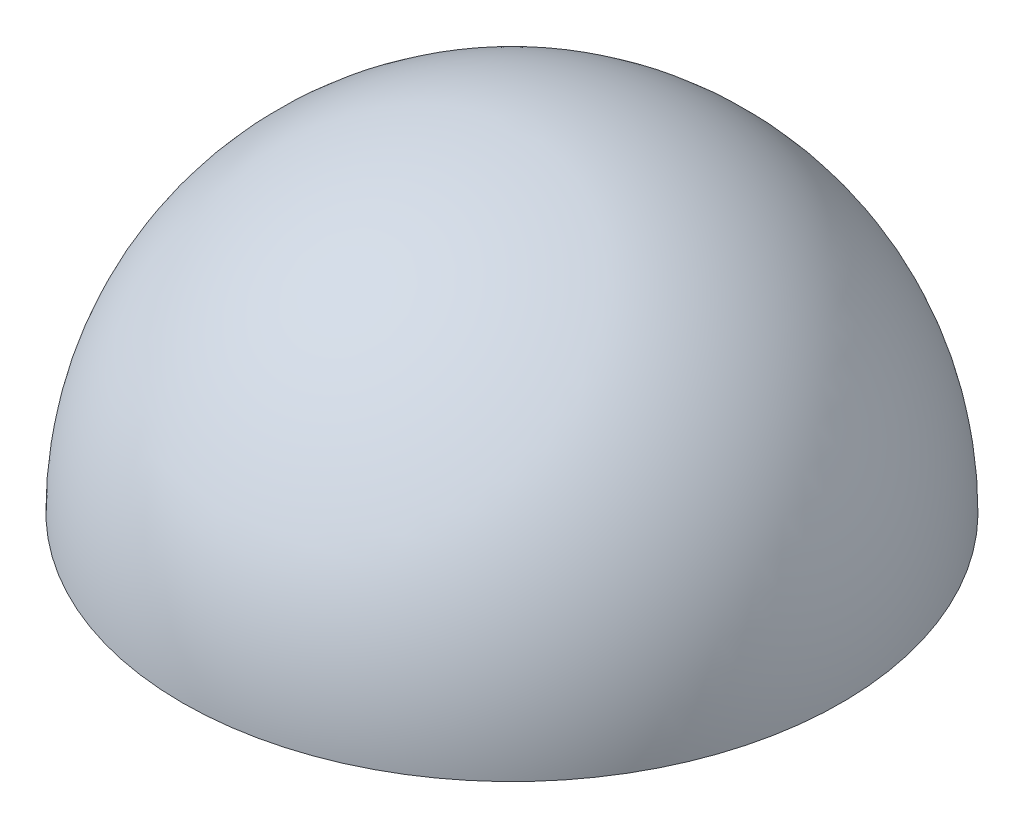
ISO-10303-21;
HEADER;
FILE_DESCRIPTION(('STEP AP214'),'2;1');
FILE_NAME('part.step','',(''),(''),'','','');
FILE_SCHEMA(('AUTOMOTIVE_DESIGN { 1 0 10303 214 1 1 1 1 }'));
ENDSEC;
DATA;
#1=APPLICATION_CONTEXT('core data for automotive mechanical design processes');
#2=APPLICATION_PROTOCOL_DEFINITION('international standard','automotive_design',2000,#1);
#3=PRODUCT_CONTEXT('',#1,'mechanical');
#4=PRODUCT('Part','Part','',(#3));
#5=PRODUCT_RELATED_PRODUCT_CATEGORY('part','',(#4));
#6=PRODUCT_DEFINITION_FORMATION('','',#4);
#7=PRODUCT_DEFINITION_CONTEXT('part definition',#1,'design');
#8=PRODUCT_DEFINITION('design','',#6,#7);
#9=PRODUCT_DEFINITION_SHAPE('','',#8);
#10=(LENGTH_UNIT() NAMED_UNIT(*) SI_UNIT(.MILLI.,.METRE.));
#11=(NAMED_UNIT(*) PLANE_ANGLE_UNIT() SI_UNIT($,.RADIAN.));
#12=(NAMED_UNIT(*) SI_UNIT($,.STERADIAN.) SOLID_ANGLE_UNIT());
#13=UNCERTAINTY_MEASURE_WITH_UNIT(LENGTH_MEASURE(1.E-05),#10,'distance_accuracy_value','');
#14=(GEOMETRIC_REPRESENTATION_CONTEXT(3) GLOBAL_UNCERTAINTY_ASSIGNED_CONTEXT((#13)) GLOBAL_UNIT_ASSIGNED_CONTEXT((#10,
#11,#12)) REPRESENTATION_CONTEXT('',''));
#15=CARTESIAN_POINT('',(0.,0.,0.));
#16=DIRECTION('',(0.,0.,1.));
#17=DIRECTION('',(1.,0.,0.));
#18=AXIS2_PLACEMENT_3D('',#15,#16,#17);
#19=CARTESIAN_POINT('',(10.,0.,0.));
#20=DIRECTION('',(-1.,0.,0.));
#21=DIRECTION('',(0.,0.,1.));
#22=AXIS2_PLACEMENT_3D('',#19,#20,#21);
#23=SPHERICAL_SURFACE('',#22,10.);
#24=CARTESIAN_POINT('',(10.,0.,0.));
#25=DIRECTION('',(0.,-1.,0.));
#26=DIRECTION('',(0.,0.,1.));
#27=AXIS2_PLACEMENT_3D('',#24,#25,#26);
#28=SPHERICAL_SURFACE('',#27,10.);
#29=CARTESIAN_POINT('',(10.,0.,0.));
#30=DIRECTION('',(0.,-1.,0.));
#31=DIRECTION('',(0.,0.,1.));
#32=AXIS2_PLACEMENT_3D('',#29,#30,#31);
#33=CIRCLE('',#32,10.);
#34=CARTESIAN_POINT('',(10.,0.,10.));
#35=VERTEX_POINT('',#34);
#36=EDGE_CURVE('E11',#35,#35,#33,.T.);
#37=ORIENTED_EDGE('',*,*,#36,.F.);
#38=EDGE_LOOP('',(#37));
#39=FACE_BOUND('',#38,.T.);
#40=ADVANCED_FACE('F35',(#39),#28,.T.);
#41=CARTESIAN_POINT('',(10.,0.,0.));
#42=DIRECTION('',(0.,1.,0.));
#43=DIRECTION('',(0.,0.,1.));
#44=AXIS2_PLACEMENT_3D('',#41,#42,#43);
#45=PLANE('',#44);
#46=CARTESIAN_POINT('',(10.,0.,0.));
#47=DIRECTION('',(0.,-1.,0.));
#48=DIRECTION('',(0.,0.,-1.));
#49=AXIS2_PLACEMENT_3D('',#46,#47,#48);
#50=CIRCLE('',#49,2.99999999999999);
#51=CARTESIAN_POINT('',(10.,0.,-2.99999999999999));
#52=VERTEX_POINT('',#51);
#53=EDGE_CURVE('E53',#52,#52,#50,.T.);
#54=ORIENTED_EDGE('',*,*,#53,.F.);
#55=EDGE_LOOP('',(#54));
#56=FACE_BOUND('',#55,.T.);
#57=ORIENTED_EDGE('',*,*,#36,.T.);
#58=EDGE_LOOP('',(#57));
#59=FACE_BOUND('',#58,.T.);
#60=ADVANCED_FACE('F48',(#56,#59),#45,.F.);
#61=CARTESIAN_POINT('',(10.,4.,0.));
#62=DIRECTION('',(0.,-1.,0.));
#63=DIRECTION('',(0.,0.,-1.));
#64=AXIS2_PLACEMENT_3D('',#61,#62,#63);
#65=CONICAL_SURFACE('',#64,3.,1.02974425867665);
#66=CARTESIAN_POINT('',(10.,5.80258185708268,0.));
#67=VERTEX_POINT('',#66);
#68=VERTEX_LOOP('',#67);
#69=FACE_BOUND('',#68,.T.);
#70=CARTESIAN_POINT('',(10.,4.,0.));
#71=DIRECTION('',(0.,-1.,0.));
#72=DIRECTION('',(0.,0.,-1.));
#73=AXIS2_PLACEMENT_3D('',#70,#71,#72);
#74=CIRCLE('',#73,3.);
#75=CARTESIAN_POINT('',(10.,4.,-3.));
#76=VERTEX_POINT('',#75);
#77=EDGE_CURVE('E41',#76,#76,#74,.T.);
#78=ORIENTED_EDGE('',*,*,#77,.T.);
#79=EDGE_LOOP('',(#78));
#80=FACE_BOUND('',#79,.T.);
#81=ADVANCED_FACE('F44',(#69,#80),#65,.F.);
#82=CARTESIAN_POINT('',(10.,0.,0.));
#83=DIRECTION('',(0.,-1.,0.));
#84=DIRECTION('',(0.,0.,-1.));
#85=AXIS2_PLACEMENT_3D('',#82,#83,#84);
#86=CYLINDRICAL_SURFACE('',#85,2.99999999999999);
#87=ORIENTED_EDGE('',*,*,#77,.F.);
#88=EDGE_LOOP('',(#87));
#89=FACE_BOUND('',#88,.T.);
#90=ORIENTED_EDGE('',*,*,#53,.T.);
#91=EDGE_LOOP('',(#90));
#92=FACE_BOUND('',#91,.T.);
#93=ADVANCED_FACE('F47',(#89,#92),#86,.F.);
#94=CLOSED_SHELL('',(#40,#60,#81,#93));
#95=MANIFOLD_SOLID_BREP('B2',#94);
#96=ADVANCED_BREP_SHAPE_REPRESENTATION('',(#18,#95),#14);
#97=SHAPE_DEFINITION_REPRESENTATION(#9,#96);
ENDSEC;
END-ISO-10303-21;
